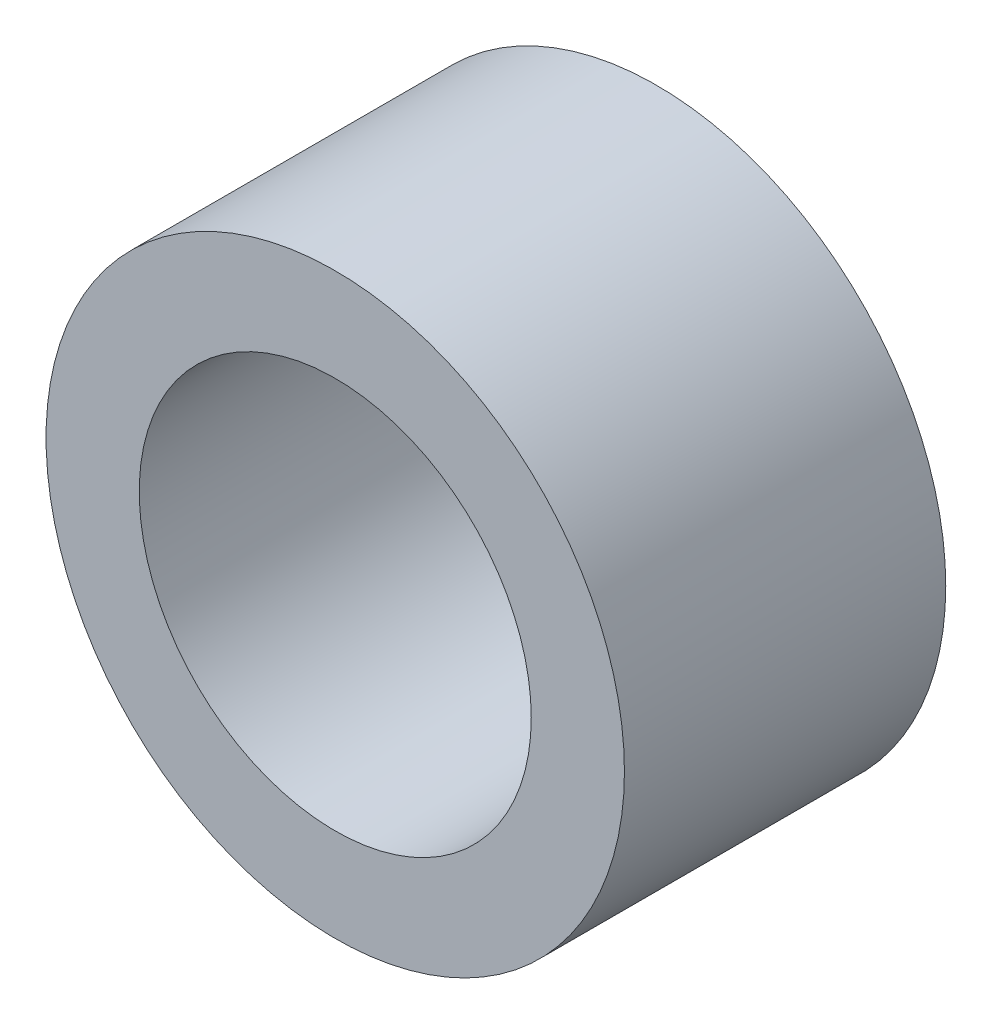
ISO-10303-21;
HEADER;
FILE_DESCRIPTION(('STEP AP214'),'2;1');
FILE_NAME('part.step','',(''),(''),'','','');
FILE_SCHEMA(('AUTOMOTIVE_DESIGN { 1 0 10303 214 1 1 1 1 }'));
ENDSEC;
DATA;
#1=APPLICATION_CONTEXT('core data for automotive mechanical design processes');
#2=APPLICATION_PROTOCOL_DEFINITION('international standard','automotive_design',2000,#1);
#3=PRODUCT_CONTEXT('',#1,'mechanical');
#4=PRODUCT('Part','Part','',(#3));
#5=PRODUCT_RELATED_PRODUCT_CATEGORY('part','',(#4));
#6=PRODUCT_DEFINITION_FORMATION('','',#4);
#7=PRODUCT_DEFINITION_CONTEXT('part definition',#1,'design');
#8=PRODUCT_DEFINITION('design','',#6,#7);
#9=PRODUCT_DEFINITION_SHAPE('','',#8);
#10=(LENGTH_UNIT() NAMED_UNIT(*) SI_UNIT(.MILLI.,.METRE.));
#11=(NAMED_UNIT(*) PLANE_ANGLE_UNIT() SI_UNIT($,.RADIAN.));
#12=(NAMED_UNIT(*) SI_UNIT($,.STERADIAN.) SOLID_ANGLE_UNIT());
#13=UNCERTAINTY_MEASURE_WITH_UNIT(LENGTH_MEASURE(1.E-05),#10,'distance_accuracy_value','');
#14=(GEOMETRIC_REPRESENTATION_CONTEXT(3) GLOBAL_UNCERTAINTY_ASSIGNED_CONTEXT((#13)) GLOBAL_UNIT_ASSIGNED_CONTEXT((#10,
#11,#12)) REPRESENTATION_CONTEXT('',''));
#15=CARTESIAN_POINT('',(0.,0.,0.));
#16=DIRECTION('',(0.,0.,1.));
#17=DIRECTION('',(1.,0.,0.));
#18=AXIS2_PLACEMENT_3D('',#15,#16,#17);
#19=CARTESIAN_POINT('',(0.,0.,5.));
#20=DIRECTION('',(0.,0.,1.));
#21=DIRECTION('',(1.,0.,0.));
#22=AXIS2_PLACEMENT_3D('',#19,#20,#21);
#23=PLANE('',#22);
#24=CARTESIAN_POINT('',(0.,0.,5.));
#25=DIRECTION('',(0.,0.,1.));
#26=DIRECTION('',(1.,0.,0.));
#27=AXIS2_PLACEMENT_3D('',#24,#25,#26);
#28=CIRCLE('',#27,4.5);
#29=CARTESIAN_POINT('',(4.5,0.,5.));
#30=VERTEX_POINT('',#29);
#31=EDGE_CURVE('E10',#30,#30,#28,.T.);
#32=ORIENTED_EDGE('',*,*,#31,.T.);
#33=EDGE_LOOP('',(#32));
#34=FACE_BOUND('',#33,.T.);
#35=CARTESIAN_POINT('',(0.,0.,5.));
#36=DIRECTION('',(0.,0.,1.));
#37=DIRECTION('',(1.,0.,0.));
#38=AXIS2_PLACEMENT_3D('',#35,#36,#37);
#39=CIRCLE('',#38,3.05);
#40=CARTESIAN_POINT('',(3.05,0.,5.));
#41=VERTEX_POINT('',#40);
#42=EDGE_CURVE('E42',#41,#41,#39,.T.);
#43=ORIENTED_EDGE('',*,*,#42,.F.);
#44=EDGE_LOOP('',(#43));
#45=FACE_BOUND('',#44,.T.);
#46=ADVANCED_FACE('F31',(#34,#45),#23,.T.);
#47=CARTESIAN_POINT('',(0.,0.,0.));
#48=DIRECTION('',(0.,0.,1.));
#49=DIRECTION('',(1.,0.,0.));
#50=AXIS2_PLACEMENT_3D('',#47,#48,#49);
#51=PLANE('',#50);
#52=CARTESIAN_POINT('',(0.,0.,0.));
#53=DIRECTION('',(0.,0.,1.));
#54=DIRECTION('',(1.,0.,0.));
#55=AXIS2_PLACEMENT_3D('',#52,#53,#54);
#56=CIRCLE('',#55,4.5);
#57=CARTESIAN_POINT('',(4.5,0.,0.));
#58=VERTEX_POINT('',#57);
#59=EDGE_CURVE('E35',#58,#58,#56,.T.);
#60=ORIENTED_EDGE('',*,*,#59,.F.);
#61=EDGE_LOOP('',(#60));
#62=FACE_BOUND('',#61,.T.);
#63=CARTESIAN_POINT('',(0.,0.,0.));
#64=DIRECTION('',(0.,0.,1.));
#65=DIRECTION('',(1.,0.,0.));
#66=AXIS2_PLACEMENT_3D('',#63,#64,#65);
#67=CIRCLE('',#66,3.05);
#68=CARTESIAN_POINT('',(3.05,0.,0.));
#69=VERTEX_POINT('',#68);
#70=EDGE_CURVE('E44',#69,#69,#67,.T.);
#71=ORIENTED_EDGE('',*,*,#70,.T.);
#72=EDGE_LOOP('',(#71));
#73=FACE_BOUND('',#72,.T.);
#74=ADVANCED_FACE('F54',(#62,#73),#51,.F.);
#75=CARTESIAN_POINT('',(0.,0.,5.));
#76=DIRECTION('',(0.,0.,-1.));
#77=DIRECTION('',(-1.,0.,0.));
#78=AXIS2_PLACEMENT_3D('',#75,#76,#77);
#79=CYLINDRICAL_SURFACE('',#78,4.5);
#80=ORIENTED_EDGE('',*,*,#31,.F.);
#81=EDGE_LOOP('',(#80));
#82=FACE_BOUND('',#81,.T.);
#83=ORIENTED_EDGE('',*,*,#59,.T.);
#84=EDGE_LOOP('',(#83));
#85=FACE_BOUND('',#84,.T.);
#86=ADVANCED_FACE('F33',(#82,#85),#79,.T.);
#87=CARTESIAN_POINT('',(0.,0.,5.));
#88=DIRECTION('',(0.,0.,-1.));
#89=DIRECTION('',(-1.,0.,0.));
#90=AXIS2_PLACEMENT_3D('',#87,#88,#89);
#91=CYLINDRICAL_SURFACE('',#90,3.05);
#92=ORIENTED_EDGE('',*,*,#42,.T.);
#93=EDGE_LOOP('',(#92));
#94=FACE_BOUND('',#93,.T.);
#95=ORIENTED_EDGE('',*,*,#70,.F.);
#96=EDGE_LOOP('',(#95));
#97=FACE_BOUND('',#96,.T.);
#98=ADVANCED_FACE('F50',(#94,#97),#91,.F.);
#99=CLOSED_SHELL('',(#46,#74,#86,#98));
#100=MANIFOLD_SOLID_BREP('B2',#99);
#101=ADVANCED_BREP_SHAPE_REPRESENTATION('',(#18,#100),#14);
#102=SHAPE_DEFINITION_REPRESENTATION(#9,#101);
ENDSEC;
END-ISO-10303-21;
